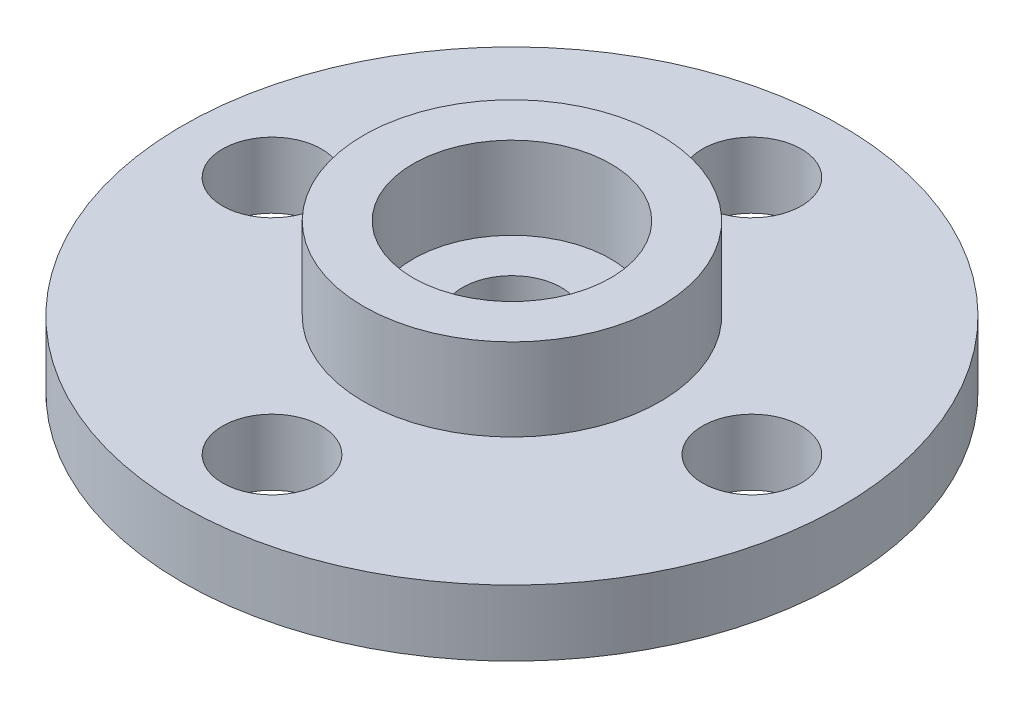
ISO-10303-21;
HEADER;
FILE_DESCRIPTION(('STEP AP214'),'2;1');
FILE_NAME('part.step','',(''),(''),'','','');
FILE_SCHEMA(('AUTOMOTIVE_DESIGN { 1 0 10303 214 1 1 1 1 }'));
ENDSEC;
DATA;
#1=APPLICATION_CONTEXT('core data for automotive mechanical design processes');
#2=APPLICATION_PROTOCOL_DEFINITION('international standard','automotive_design',2000,#1);
#3=PRODUCT_CONTEXT('',#1,'mechanical');
#4=PRODUCT('Part','Part','',(#3));
#5=PRODUCT_RELATED_PRODUCT_CATEGORY('part','',(#4));
#6=PRODUCT_DEFINITION_FORMATION('','',#4);
#7=PRODUCT_DEFINITION_CONTEXT('part definition',#1,'design');
#8=PRODUCT_DEFINITION('design','',#6,#7);
#9=PRODUCT_DEFINITION_SHAPE('','',#8);
#10=(LENGTH_UNIT() NAMED_UNIT(*) SI_UNIT(.MILLI.,.METRE.));
#11=(NAMED_UNIT(*) PLANE_ANGLE_UNIT() SI_UNIT($,.RADIAN.));
#12=(NAMED_UNIT(*) SI_UNIT($,.STERADIAN.) SOLID_ANGLE_UNIT());
#13=UNCERTAINTY_MEASURE_WITH_UNIT(LENGTH_MEASURE(1.E-05),#10,'distance_accuracy_value','');
#14=(GEOMETRIC_REPRESENTATION_CONTEXT(3) GLOBAL_UNCERTAINTY_ASSIGNED_CONTEXT((#13)) GLOBAL_UNIT_ASSIGNED_CONTEXT((#10,
#11,#12)) REPRESENTATION_CONTEXT('',''));
#15=CARTESIAN_POINT('',(0.,0.,0.));
#16=DIRECTION('',(0.,0.,1.));
#17=DIRECTION('',(1.,0.,0.));
#18=AXIS2_PLACEMENT_3D('',#15,#16,#17);
#19=CARTESIAN_POINT('',(0.,2.,0.));
#20=DIRECTION('',(0.,-1.,0.));
#21=DIRECTION('',(0.,0.,-1.));
#22=AXIS2_PLACEMENT_3D('',#19,#20,#21);
#23=CYLINDRICAL_SURFACE('',#22,10.);
#24=CARTESIAN_POINT('',(0.,2.,0.));
#25=DIRECTION('',(0.,1.,0.));
#26=DIRECTION('',(0.,0.,1.));
#27=AXIS2_PLACEMENT_3D('',#24,#25,#26);
#28=CIRCLE('',#27,10.);
#29=CARTESIAN_POINT('',(0.,2.,10.));
#30=VERTEX_POINT('',#29);
#31=EDGE_CURVE('E41',#30,#30,#28,.T.);
#32=ORIENTED_EDGE('',*,*,#31,.F.);
#33=EDGE_LOOP('',(#32));
#34=FACE_BOUND('',#33,.T.);
#35=CARTESIAN_POINT('',(0.,0.,0.));
#36=DIRECTION('',(0.,1.,0.));
#37=DIRECTION('',(0.,0.,1.));
#38=AXIS2_PLACEMENT_3D('',#35,#36,#37);
#39=CIRCLE('',#38,10.);
#40=CARTESIAN_POINT('',(0.,0.,10.));
#41=VERTEX_POINT('',#40);
#42=EDGE_CURVE('E46',#41,#41,#39,.T.);
#43=ORIENTED_EDGE('',*,*,#42,.T.);
#44=EDGE_LOOP('',(#43));
#45=FACE_BOUND('',#44,.T.);
#46=ADVANCED_FACE('F34',(#34,#45),#23,.T.);
#47=CARTESIAN_POINT('',(0.,2.,0.));
#48=DIRECTION('',(0.,1.,0.));
#49=DIRECTION('',(0.,0.,1.));
#50=AXIS2_PLACEMENT_3D('',#47,#48,#49);
#51=PLANE('',#50);
#52=CARTESIAN_POINT('',(0.,2.,-7.28));
#53=DIRECTION('',(0.,1.,0.));
#54=DIRECTION('',(0.,0.,1.));
#55=AXIS2_PLACEMENT_3D('',#52,#53,#54);
#56=CIRCLE('',#55,1.5);
#57=CARTESIAN_POINT('',(0.,2.,-5.78));
#58=VERTEX_POINT('',#57);
#59=EDGE_CURVE('E80',#58,#58,#56,.T.);
#60=ORIENTED_EDGE('',*,*,#59,.F.);
#61=EDGE_LOOP('',(#60));
#62=FACE_BOUND('',#61,.T.);
#63=CARTESIAN_POINT('',(7.28000000000021,2.,-2.05572730348672E-13));
#64=DIRECTION('',(0.,1.,0.));
#65=DIRECTION('',(0.,0.,1.));
#66=AXIS2_PLACEMENT_3D('',#63,#64,#65);
#67=CIRCLE('',#66,1.50000000000016);
#68=CARTESIAN_POINT('',(7.28000000000021,2.,1.49999999999996));
#69=VERTEX_POINT('',#68);
#70=EDGE_CURVE('E81',#69,#69,#67,.T.);
#71=ORIENTED_EDGE('',*,*,#70,.F.);
#72=EDGE_LOOP('',(#71));
#73=FACE_BOUND('',#72,.T.);
#74=CARTESIAN_POINT('',(4.11145460697345E-13,2.,7.28));
#75=DIRECTION('',(0.,1.,0.));
#76=DIRECTION('',(0.,0.,1.));
#77=AXIS2_PLACEMENT_3D('',#74,#75,#76);
#78=CIRCLE('',#77,1.50000000000044);
#79=CARTESIAN_POINT('',(4.11145460697345E-13,2.,8.78000000000044));
#80=VERTEX_POINT('',#79);
#81=EDGE_CURVE('E84',#80,#80,#78,.T.);
#82=ORIENTED_EDGE('',*,*,#81,.F.);
#83=EDGE_LOOP('',(#82));
#84=FACE_BOUND('',#83,.T.);
#85=CARTESIAN_POINT('',(-7.2799999999998,2.,2.06464273218452E-13));
#86=DIRECTION('',(0.,1.,0.));
#87=DIRECTION('',(0.,0.,1.));
#88=AXIS2_PLACEMENT_3D('',#85,#86,#87);
#89=CIRCLE('',#88,1.50000000000033);
#90=CARTESIAN_POINT('',(-7.2799999999998,2.,1.50000000000054));
#91=VERTEX_POINT('',#90);
#92=EDGE_CURVE('E87',#91,#91,#89,.T.);
#93=ORIENTED_EDGE('',*,*,#92,.F.);
#94=EDGE_LOOP('',(#93));
#95=FACE_BOUND('',#94,.T.);
#96=CARTESIAN_POINT('',(0.,2.,0.));
#97=DIRECTION('',(0.,1.,0.));
#98=DIRECTION('',(0.,0.,1.));
#99=AXIS2_PLACEMENT_3D('',#96,#97,#98);
#100=CIRCLE('',#99,4.5);
#101=CARTESIAN_POINT('',(0.,2.,4.5));
#102=VERTEX_POINT('',#101);
#103=EDGE_CURVE('E10',#102,#102,#100,.T.);
#104=ORIENTED_EDGE('',*,*,#103,.F.);
#105=EDGE_LOOP('',(#104));
#106=FACE_BOUND('',#105,.T.);
#107=ORIENTED_EDGE('',*,*,#31,.T.);
#108=EDGE_LOOP('',(#107));
#109=FACE_BOUND('',#108,.T.);
#110=ADVANCED_FACE('F96',(#62,#73,#84,#95,#106,#109),#51,.T.);
#111=CARTESIAN_POINT('',(0.,0.,0.));
#112=DIRECTION('',(0.,1.,0.));
#113=DIRECTION('',(0.,0.,1.));
#114=AXIS2_PLACEMENT_3D('',#111,#112,#113);
#115=PLANE('',#114);
#116=CARTESIAN_POINT('',(0.,0.,-7.28));
#117=DIRECTION('',(0.,1.,0.));
#118=DIRECTION('',(0.,0.,1.));
#119=AXIS2_PLACEMENT_3D('',#116,#117,#118);
#120=CIRCLE('',#119,1.5);
#121=CARTESIAN_POINT('',(0.,0.,-5.78));
#122=VERTEX_POINT('',#121);
#123=EDGE_CURVE('E37',#122,#122,#120,.T.);
#124=ORIENTED_EDGE('',*,*,#123,.T.);
#125=EDGE_LOOP('',(#124));
#126=FACE_BOUND('',#125,.T.);
#127=CARTESIAN_POINT('',(7.28000000000021,0.,-2.05572730348672E-13));
#128=DIRECTION('',(0.,1.,0.));
#129=DIRECTION('',(0.,0.,1.));
#130=AXIS2_PLACEMENT_3D('',#127,#128,#129);
#131=CIRCLE('',#130,1.50000000000016);
#132=CARTESIAN_POINT('',(7.28000000000021,0.,1.49999999999996));
#133=VERTEX_POINT('',#132);
#134=EDGE_CURVE('E63',#133,#133,#131,.T.);
#135=ORIENTED_EDGE('',*,*,#134,.T.);
#136=EDGE_LOOP('',(#135));
#137=FACE_BOUND('',#136,.T.);
#138=CARTESIAN_POINT('',(4.11145460697345E-13,0.,7.28));
#139=DIRECTION('',(0.,1.,0.));
#140=DIRECTION('',(0.,0.,1.));
#141=AXIS2_PLACEMENT_3D('',#138,#139,#140);
#142=CIRCLE('',#141,1.50000000000044);
#143=CARTESIAN_POINT('',(4.11145460697345E-13,0.,8.78000000000044));
#144=VERTEX_POINT('',#143);
#145=EDGE_CURVE('E61',#144,#144,#142,.T.);
#146=ORIENTED_EDGE('',*,*,#145,.T.);
#147=EDGE_LOOP('',(#146));
#148=FACE_BOUND('',#147,.T.);
#149=CARTESIAN_POINT('',(-7.2799999999998,0.,2.06464273218452E-13));
#150=DIRECTION('',(0.,1.,0.));
#151=DIRECTION('',(0.,0.,1.));
#152=AXIS2_PLACEMENT_3D('',#149,#150,#151);
#153=CIRCLE('',#152,1.50000000000033);
#154=CARTESIAN_POINT('',(-7.2799999999998,0.,1.50000000000054));
#155=VERTEX_POINT('',#154);
#156=EDGE_CURVE('E57',#155,#155,#153,.T.);
#157=ORIENTED_EDGE('',*,*,#156,.T.);
#158=EDGE_LOOP('',(#157));
#159=FACE_BOUND('',#158,.T.);
#160=CARTESIAN_POINT('',(0.,0.,0.));
#161=DIRECTION('',(0.,1.,0.));
#162=DIRECTION('',(0.,0.,1.));
#163=AXIS2_PLACEMENT_3D('',#160,#161,#162);
#164=CIRCLE('',#163,1.5);
#165=CARTESIAN_POINT('',(0.,0.,1.5));
#166=VERTEX_POINT('',#165);
#167=EDGE_CURVE('E54',#166,#166,#164,.T.);
#168=ORIENTED_EDGE('',*,*,#167,.T.);
#169=EDGE_LOOP('',(#168));
#170=FACE_BOUND('',#169,.T.);
#171=ORIENTED_EDGE('',*,*,#42,.F.);
#172=EDGE_LOOP('',(#171));
#173=FACE_BOUND('',#172,.T.);
#174=ADVANCED_FACE('F99',(#126,#137,#148,#159,#170,#173),#115,.F.);
#175=CARTESIAN_POINT('',(0.,4.5,0.));
#176=DIRECTION('',(0.,-1.,0.));
#177=DIRECTION('',(0.,0.,-1.));
#178=AXIS2_PLACEMENT_3D('',#175,#176,#177);
#179=CYLINDRICAL_SURFACE('',#178,4.5);
#180=CARTESIAN_POINT('',(0.,4.5,0.));
#181=DIRECTION('',(0.,1.,0.));
#182=DIRECTION('',(0.,0.,1.));
#183=AXIS2_PLACEMENT_3D('',#180,#181,#182);
#184=CIRCLE('',#183,4.5);
#185=CARTESIAN_POINT('',(0.,4.5,4.5));
#186=VERTEX_POINT('',#185);
#187=EDGE_CURVE('E49',#186,#186,#184,.T.);
#188=ORIENTED_EDGE('',*,*,#187,.F.);
#189=EDGE_LOOP('',(#188));
#190=FACE_BOUND('',#189,.T.);
#191=ORIENTED_EDGE('',*,*,#103,.T.);
#192=EDGE_LOOP('',(#191));
#193=FACE_BOUND('',#192,.T.);
#194=ADVANCED_FACE('F112',(#190,#193),#179,.T.);
#195=CARTESIAN_POINT('',(0.,4.5,0.));
#196=DIRECTION('',(0.,1.,0.));
#197=DIRECTION('',(0.,0.,1.));
#198=AXIS2_PLACEMENT_3D('',#195,#196,#197);
#199=PLANE('',#198);
#200=CARTESIAN_POINT('',(0.,4.5,0.));
#201=DIRECTION('',(0.,1.,0.));
#202=DIRECTION('',(0.,0.,1.));
#203=AXIS2_PLACEMENT_3D('',#200,#201,#202);
#204=CIRCLE('',#203,3.);
#205=CARTESIAN_POINT('',(0.,4.5,3.));
#206=VERTEX_POINT('',#205);
#207=EDGE_CURVE('E68',#206,#206,#204,.T.);
#208=ORIENTED_EDGE('',*,*,#207,.F.);
#209=EDGE_LOOP('',(#208));
#210=FACE_BOUND('',#209,.T.);
#211=ORIENTED_EDGE('',*,*,#187,.T.);
#212=EDGE_LOOP('',(#211));
#213=FACE_BOUND('',#212,.T.);
#214=ADVANCED_FACE('F116',(#210,#213),#199,.T.);
#215=CARTESIAN_POINT('',(0.,2.,0.));
#216=DIRECTION('',(0.,1.,0.));
#217=DIRECTION('',(0.,0.,1.));
#218=AXIS2_PLACEMENT_3D('',#215,#216,#217);
#219=CYLINDRICAL_SURFACE('',#218,3.);
#220=CARTESIAN_POINT('',(0.,2.,0.));
#221=DIRECTION('',(0.,1.,0.));
#222=DIRECTION('',(0.,0.,1.));
#223=AXIS2_PLACEMENT_3D('',#220,#221,#222);
#224=CIRCLE('',#223,3.);
#225=CARTESIAN_POINT('',(0.,2.,3.));
#226=VERTEX_POINT('',#225);
#227=EDGE_CURVE('E72',#226,#226,#224,.T.);
#228=ORIENTED_EDGE('',*,*,#227,.F.);
#229=EDGE_LOOP('',(#228));
#230=FACE_BOUND('',#229,.T.);
#231=ORIENTED_EDGE('',*,*,#207,.T.);
#232=EDGE_LOOP('',(#231));
#233=FACE_BOUND('',#232,.T.);
#234=ADVANCED_FACE('F122',(#230,#233),#219,.F.);
#235=CARTESIAN_POINT('',(0.,2.,0.));
#236=DIRECTION('',(0.,1.,0.));
#237=DIRECTION('',(0.,0.,1.));
#238=AXIS2_PLACEMENT_3D('',#235,#236,#237);
#239=PLANE('',#238);
#240=CARTESIAN_POINT('',(0.,2.,0.));
#241=DIRECTION('',(0.,1.,0.));
#242=DIRECTION('',(0.,0.,1.));
#243=AXIS2_PLACEMENT_3D('',#240,#241,#242);
#244=CIRCLE('',#243,1.5);
#245=CARTESIAN_POINT('',(0.,2.,1.5));
#246=VERTEX_POINT('',#245);
#247=EDGE_CURVE('E58',#246,#246,#244,.T.);
#248=ORIENTED_EDGE('',*,*,#247,.F.);
#249=EDGE_LOOP('',(#248));
#250=FACE_BOUND('',#249,.T.);
#251=ORIENTED_EDGE('',*,*,#227,.T.);
#252=EDGE_LOOP('',(#251));
#253=FACE_BOUND('',#252,.T.);
#254=ADVANCED_FACE('F126',(#250,#253),#239,.T.);
#255=CARTESIAN_POINT('',(0.,-0.5,0.));
#256=DIRECTION('',(0.,1.,0.));
#257=DIRECTION('',(0.,0.,1.));
#258=AXIS2_PLACEMENT_3D('',#255,#256,#257);
#259=CYLINDRICAL_SURFACE('',#258,1.5);
#260=ORIENTED_EDGE('',*,*,#247,.T.);
#261=EDGE_LOOP('',(#260));
#262=FACE_BOUND('',#261,.T.);
#263=ORIENTED_EDGE('',*,*,#167,.F.);
#264=EDGE_LOOP('',(#263));
#265=FACE_BOUND('',#264,.T.);
#266=ADVANCED_FACE('F130',(#262,#265),#259,.F.);
#267=CARTESIAN_POINT('',(-7.2799999999998,-0.5,2.06464273218452E-13));
#268=DIRECTION('',(0.,1.,0.));
#269=DIRECTION('',(0.,0.,1.));
#270=AXIS2_PLACEMENT_3D('',#267,#268,#269);
#271=CYLINDRICAL_SURFACE('',#270,1.50000000000033);
#272=ORIENTED_EDGE('',*,*,#92,.T.);
#273=EDGE_LOOP('',(#272));
#274=FACE_BOUND('',#273,.T.);
#275=ORIENTED_EDGE('',*,*,#156,.F.);
#276=EDGE_LOOP('',(#275));
#277=FACE_BOUND('',#276,.T.);
#278=ADVANCED_FACE('F134',(#274,#277),#271,.F.);
#279=CARTESIAN_POINT('',(4.11145460697345E-13,-0.5,7.28));
#280=DIRECTION('',(0.,1.,0.));
#281=DIRECTION('',(0.,0.,1.));
#282=AXIS2_PLACEMENT_3D('',#279,#280,#281);
#283=CYLINDRICAL_SURFACE('',#282,1.50000000000044);
#284=ORIENTED_EDGE('',*,*,#81,.T.);
#285=EDGE_LOOP('',(#284));
#286=FACE_BOUND('',#285,.T.);
#287=ORIENTED_EDGE('',*,*,#145,.F.);
#288=EDGE_LOOP('',(#287));
#289=FACE_BOUND('',#288,.T.);
#290=ADVANCED_FACE('F93',(#286,#289),#283,.F.);
#291=CARTESIAN_POINT('',(7.28000000000021,-0.5,-2.05572730348672E-13));
#292=DIRECTION('',(0.,1.,0.));
#293=DIRECTION('',(0.,0.,1.));
#294=AXIS2_PLACEMENT_3D('',#291,#292,#293);
#295=CYLINDRICAL_SURFACE('',#294,1.50000000000016);
#296=ORIENTED_EDGE('',*,*,#70,.T.);
#297=EDGE_LOOP('',(#296));
#298=FACE_BOUND('',#297,.T.);
#299=ORIENTED_EDGE('',*,*,#134,.F.);
#300=EDGE_LOOP('',(#299));
#301=FACE_BOUND('',#300,.T.);
#302=ADVANCED_FACE('F136',(#298,#301),#295,.F.);
#303=CARTESIAN_POINT('',(0.,-0.5,-7.28));
#304=DIRECTION('',(0.,1.,0.));
#305=DIRECTION('',(0.,0.,1.));
#306=AXIS2_PLACEMENT_3D('',#303,#304,#305);
#307=CYLINDRICAL_SURFACE('',#306,1.5);
#308=ORIENTED_EDGE('',*,*,#59,.T.);
#309=EDGE_LOOP('',(#308));
#310=FACE_BOUND('',#309,.T.);
#311=ORIENTED_EDGE('',*,*,#123,.F.);
#312=EDGE_LOOP('',(#311));
#313=FACE_BOUND('',#312,.T.);
#314=ADVANCED_FACE('F139',(#310,#313),#307,.F.);
#315=CLOSED_SHELL('',(#46,#110,#174,#194,#214,#234,#254,#266,#278,#290,#302,#314));
#316=MANIFOLD_SOLID_BREP('B2',#315);
#317=ADVANCED_BREP_SHAPE_REPRESENTATION('',(#18,#316),#14);
#318=SHAPE_DEFINITION_REPRESENTATION(#9,#317);
ENDSEC;
END-ISO-10303-21;
